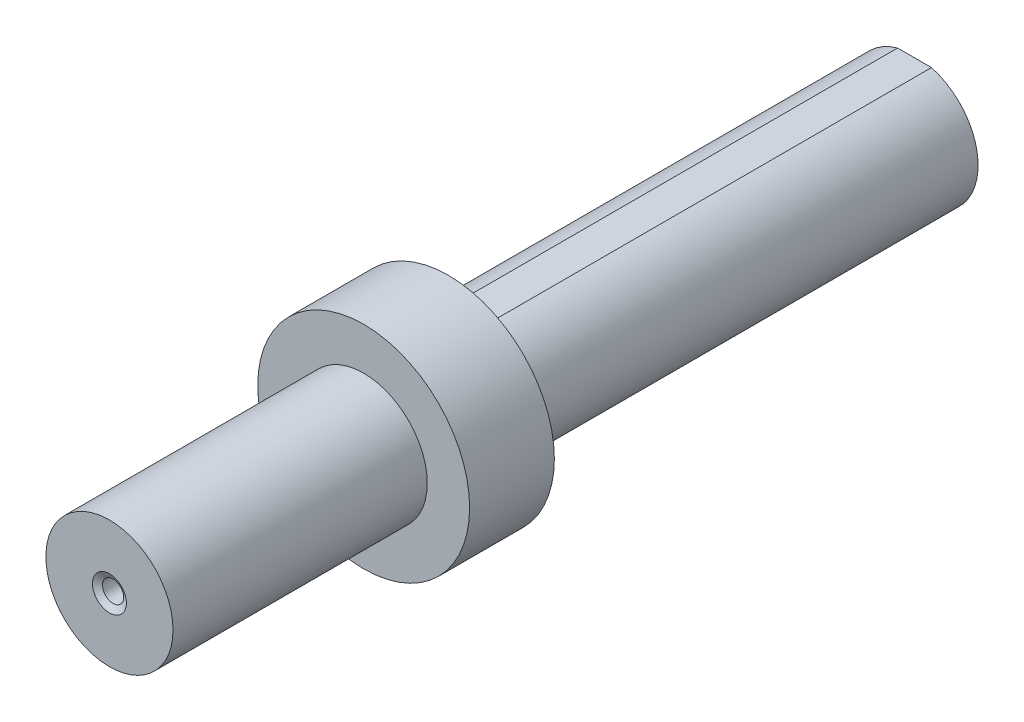
ISO-10303-21;
HEADER;
FILE_DESCRIPTION(('STEP AP214'),'2;1');
FILE_NAME('part.step','',(''),(''),'','','');
FILE_SCHEMA(('AUTOMOTIVE_DESIGN { 1 0 10303 214 1 1 1 1 }'));
ENDSEC;
DATA;
#1=APPLICATION_CONTEXT('core data for automotive mechanical design processes');
#2=APPLICATION_PROTOCOL_DEFINITION('international standard','automotive_design',2000,#1);
#3=PRODUCT_CONTEXT('',#1,'mechanical');
#4=PRODUCT('Part','Part','',(#3));
#5=PRODUCT_RELATED_PRODUCT_CATEGORY('part','',(#4));
#6=PRODUCT_DEFINITION_FORMATION('','',#4);
#7=PRODUCT_DEFINITION_CONTEXT('part definition',#1,'design');
#8=PRODUCT_DEFINITION('design','',#6,#7);
#9=PRODUCT_DEFINITION_SHAPE('','',#8);
#10=(LENGTH_UNIT() NAMED_UNIT(*) SI_UNIT(.MILLI.,.METRE.));
#11=(NAMED_UNIT(*) PLANE_ANGLE_UNIT() SI_UNIT($,.RADIAN.));
#12=(NAMED_UNIT(*) SI_UNIT($,.STERADIAN.) SOLID_ANGLE_UNIT());
#13=UNCERTAINTY_MEASURE_WITH_UNIT(LENGTH_MEASURE(1.E-05),#10,'distance_accuracy_value','');
#14=(GEOMETRIC_REPRESENTATION_CONTEXT(3) GLOBAL_UNCERTAINTY_ASSIGNED_CONTEXT((#13)) GLOBAL_UNIT_ASSIGNED_CONTEXT((#10,
#11,#12)) REPRESENTATION_CONTEXT('',''));
#15=CARTESIAN_POINT('',(0.,0.,0.));
#16=DIRECTION('',(0.,0.,1.));
#17=DIRECTION('',(1.,0.,0.));
#18=AXIS2_PLACEMENT_3D('',#15,#16,#17);
#19=CARTESIAN_POINT('',(0.,0.,10.));
#20=DIRECTION('',(0.,0.,-1.));
#21=DIRECTION('',(-1.,0.,0.));
#22=AXIS2_PLACEMENT_3D('',#19,#20,#21);
#23=CYLINDRICAL_SURFACE('',#22,12.5);
#24=CARTESIAN_POINT('',(0.,0.,10.));
#25=DIRECTION('',(0.,0.,1.));
#26=DIRECTION('',(1.,0.,0.));
#27=AXIS2_PLACEMENT_3D('',#24,#25,#26);
#28=CIRCLE('',#27,12.5);
#29=CARTESIAN_POINT('',(12.5,0.,10.));
#30=VERTEX_POINT('',#29);
#31=EDGE_CURVE('E58',#30,#30,#28,.T.);
#32=ORIENTED_EDGE('',*,*,#31,.F.);
#33=EDGE_LOOP('',(#32));
#34=FACE_BOUND('',#33,.T.);
#35=CARTESIAN_POINT('',(0.,0.,0.));
#36=DIRECTION('',(0.,0.,1.));
#37=DIRECTION('',(1.,0.,0.));
#38=AXIS2_PLACEMENT_3D('',#35,#36,#37);
#39=CIRCLE('',#38,12.5);
#40=CARTESIAN_POINT('',(12.5,0.,0.));
#41=VERTEX_POINT('',#40);
#42=EDGE_CURVE('E121',#41,#41,#39,.T.);
#43=ORIENTED_EDGE('',*,*,#42,.T.);
#44=EDGE_LOOP('',(#43));
#45=FACE_BOUND('',#44,.T.);
#46=ADVANCED_FACE('F50',(#34,#45),#23,.T.);
#47=CARTESIAN_POINT('',(0.,0.,10.));
#48=DIRECTION('',(0.,0.,1.));
#49=DIRECTION('',(1.,0.,0.));
#50=AXIS2_PLACEMENT_3D('',#47,#48,#49);
#51=PLANE('',#50);
#52=CARTESIAN_POINT('',(0.,0.,10.));
#53=DIRECTION('',(0.,0.,1.));
#54=DIRECTION('',(1.,0.,0.));
#55=AXIS2_PLACEMENT_3D('',#52,#53,#54);
#56=CIRCLE('',#55,7.5);
#57=CARTESIAN_POINT('',(7.5,0.,10.));
#58=VERTEX_POINT('',#57);
#59=EDGE_CURVE('E117',#58,#58,#56,.F.);
#60=ORIENTED_EDGE('',*,*,#59,.T.);
#61=EDGE_LOOP('',(#60));
#62=FACE_BOUND('',#61,.T.);
#63=ORIENTED_EDGE('',*,*,#31,.T.);
#64=EDGE_LOOP('',(#63));
#65=FACE_BOUND('',#64,.T.);
#66=ADVANCED_FACE('F131',(#62,#65),#51,.T.);
#67=CARTESIAN_POINT('',(0.,0.,0.));
#68=DIRECTION('',(0.,0.,1.));
#69=DIRECTION('',(1.,0.,0.));
#70=AXIS2_PLACEMENT_3D('',#67,#68,#69);
#71=PLANE('',#70);
#72=DIRECTION('',(-1.,0.,0.));
#73=VECTOR('',#72,1.);
#74=CARTESIAN_POINT('',(2.,7.22841614740048,0.));
#75=LINE('',#74,#73);
#76=CARTESIAN_POINT('',(2.,7.22841614740048,0.));
#77=VERTEX_POINT('',#76);
#78=CARTESIAN_POINT('',(-2.,7.22841614740048,0.));
#79=VERTEX_POINT('',#78);
#80=EDGE_CURVE('E80',#77,#79,#75,.T.);
#81=ORIENTED_EDGE('',*,*,#80,.T.);
#82=CARTESIAN_POINT('',(0.,0.,0.));
#83=DIRECTION('',(0.,0.,1.));
#84=DIRECTION('',(1.,0.,0.));
#85=AXIS2_PLACEMENT_3D('',#82,#83,#84);
#86=CIRCLE('',#85,7.5);
#87=EDGE_CURVE('E11',#77,#79,#86,.F.);
#88=ORIENTED_EDGE('',*,*,#87,.F.);
#89=EDGE_LOOP('',(#81,#88));
#90=FACE_BOUND('',#89,.T.);
#91=ORIENTED_EDGE('',*,*,#42,.F.);
#92=EDGE_LOOP('',(#91));
#93=FACE_BOUND('',#92,.T.);
#94=ADVANCED_FACE('F90',(#90,#93),#71,.F.);
#95=CARTESIAN_POINT('',(0.,0.,40.));
#96=DIRECTION('',(0.,0.,-1.));
#97=DIRECTION('',(-1.,0.,0.));
#98=AXIS2_PLACEMENT_3D('',#95,#96,#97);
#99=CYLINDRICAL_SURFACE('',#98,7.5);
#100=ORIENTED_EDGE('',*,*,#59,.F.);
#101=EDGE_LOOP('',(#100));
#102=FACE_BOUND('',#101,.T.);
#103=CARTESIAN_POINT('',(0.,0.,40.));
#104=DIRECTION('',(0.,0.,1.));
#105=DIRECTION('',(1.,0.,0.));
#106=AXIS2_PLACEMENT_3D('',#103,#104,#105);
#107=CIRCLE('',#106,7.5);
#108=CARTESIAN_POINT('',(7.5,0.,40.));
#109=VERTEX_POINT('',#108);
#110=EDGE_CURVE('E113',#109,#109,#107,.T.);
#111=ORIENTED_EDGE('',*,*,#110,.F.);
#112=EDGE_LOOP('',(#111));
#113=FACE_BOUND('',#112,.T.);
#114=ADVANCED_FACE('F130',(#102,#113),#99,.T.);
#115=CARTESIAN_POINT('',(0.,0.,40.));
#116=DIRECTION('',(0.,0.,1.));
#117=DIRECTION('',(1.,0.,0.));
#118=AXIS2_PLACEMENT_3D('',#115,#116,#117);
#119=PLANE('',#118);
#120=CARTESIAN_POINT('',(0.,0.,40.));
#121=DIRECTION('',(0.,0.,1.));
#122=DIRECTION('',(1.,0.,0.));
#123=AXIS2_PLACEMENT_3D('',#120,#121,#122);
#124=CIRCLE('',#123,2.);
#125=CARTESIAN_POINT('',(2.,0.,40.));
#126=VERTEX_POINT('',#125);
#127=EDGE_CURVE('E86',#126,#126,#124,.T.);
#128=ORIENTED_EDGE('',*,*,#127,.F.);
#129=EDGE_LOOP('',(#128));
#130=FACE_BOUND('',#129,.T.);
#131=ORIENTED_EDGE('',*,*,#110,.T.);
#132=EDGE_LOOP('',(#131));
#133=FACE_BOUND('',#132,.T.);
#134=ADVANCED_FACE('F137',(#130,#133),#119,.T.);
#135=CARTESIAN_POINT('',(0.,0.,-55.));
#136=DIRECTION('',(0.,0.,1.));
#137=DIRECTION('',(1.,0.,0.));
#138=AXIS2_PLACEMENT_3D('',#135,#136,#137);
#139=CYLINDRICAL_SURFACE('',#138,7.5);
#140=ORIENTED_EDGE('',*,*,#87,.T.);
#141=DIRECTION('',(0.,0.,-1.));
#142=VECTOR('',#141,1.);
#143=CARTESIAN_POINT('',(-2.,7.22841614740048,0.));
#144=LINE('',#143,#142);
#145=CARTESIAN_POINT('',(-2.,7.22841614740048,-55.));
#146=VERTEX_POINT('',#145);
#147=EDGE_CURVE('E77',#79,#146,#144,.T.);
#148=ORIENTED_EDGE('',*,*,#147,.T.);
#149=CARTESIAN_POINT('',(0.,0.,-55.));
#150=DIRECTION('',(0.,0.,-1.));
#151=DIRECTION('',(-1.,0.,0.));
#152=AXIS2_PLACEMENT_3D('',#149,#150,#151);
#153=CIRCLE('',#152,7.5);
#154=CARTESIAN_POINT('',(2.,7.22841614740048,-55.));
#155=VERTEX_POINT('',#154);
#156=EDGE_CURVE('E95',#155,#146,#153,.T.);
#157=ORIENTED_EDGE('',*,*,#156,.F.);
#158=DIRECTION('',(0.,0.,-1.));
#159=VECTOR('',#158,1.);
#160=CARTESIAN_POINT('',(2.,7.22841614740048,0.));
#161=LINE('',#160,#159);
#162=EDGE_CURVE('E65',#77,#155,#161,.T.);
#163=ORIENTED_EDGE('',*,*,#162,.F.);
#164=EDGE_LOOP('',(#140,#148,#157,#163));
#165=FACE_BOUND('',#164,.T.);
#166=ADVANCED_FACE('F94',(#165),#139,.T.);
#167=CARTESIAN_POINT('',(0.,0.,-55.));
#168=DIRECTION('',(0.,0.,-1.));
#169=DIRECTION('',(-1.,0.,0.));
#170=AXIS2_PLACEMENT_3D('',#167,#168,#169);
#171=PLANE('',#170);
#172=DIRECTION('',(-1.,0.,0.));
#173=VECTOR('',#172,1.);
#174=CARTESIAN_POINT('',(2.,7.22841614740048,-55.));
#175=LINE('',#174,#173);
#176=EDGE_CURVE('E81',#155,#146,#175,.T.);
#177=ORIENTED_EDGE('',*,*,#176,.F.);
#178=ORIENTED_EDGE('',*,*,#156,.T.);
#179=EDGE_LOOP('',(#177,#178));
#180=FACE_BOUND('',#179,.T.);
#181=ADVANCED_FACE('F171',(#180),#171,.T.);
#182=CARTESIAN_POINT('',(0.,0.,25.));
#183=DIRECTION('',(0.,0.,1.));
#184=DIRECTION('',(1.,0.,0.));
#185=AXIS2_PLACEMENT_3D('',#182,#183,#184);
#186=CONICAL_SURFACE('',#185,1.24999999999999,1.02974425867665);
#187=CARTESIAN_POINT('',(0.,0.,24.2489242262156));
#188=VERTEX_POINT('',#187);
#189=VERTEX_LOOP('',#188);
#190=FACE_BOUND('',#189,.T.);
#191=CARTESIAN_POINT('',(0.,0.,25.));
#192=DIRECTION('',(0.,0.,1.));
#193=DIRECTION('',(1.,0.,0.));
#194=AXIS2_PLACEMENT_3D('',#191,#192,#193);
#195=CIRCLE('',#194,1.24999999999999);
#196=CARTESIAN_POINT('',(1.24999999999999,0.,25.));
#197=VERTEX_POINT('',#196);
#198=EDGE_CURVE('E107',#197,#197,#195,.T.);
#199=ORIENTED_EDGE('',*,*,#198,.T.);
#200=EDGE_LOOP('',(#199));
#201=FACE_BOUND('',#200,.T.);
#202=ADVANCED_FACE('F181',(#190,#201),#186,.F.);
#203=CARTESIAN_POINT('',(0.,0.,40.));
#204=DIRECTION('',(0.,0.,1.));
#205=DIRECTION('',(1.,0.,0.));
#206=AXIS2_PLACEMENT_3D('',#203,#204,#205);
#207=CYLINDRICAL_SURFACE('',#206,1.24999999999999);
#208=ORIENTED_EDGE('',*,*,#198,.F.);
#209=EDGE_LOOP('',(#208));
#210=FACE_BOUND('',#209,.T.);
#211=CARTESIAN_POINT('',(0.,0.,39.5669872981078));
#212=DIRECTION('',(0.,0.,1.));
#213=DIRECTION('',(1.,0.,0.));
#214=AXIS2_PLACEMENT_3D('',#211,#212,#213);
#215=CIRCLE('',#214,1.25);
#216=CARTESIAN_POINT('',(1.25,0.,39.5669872981078));
#217=VERTEX_POINT('',#216);
#218=EDGE_CURVE('E103',#217,#217,#215,.T.);
#219=ORIENTED_EDGE('',*,*,#218,.T.);
#220=EDGE_LOOP('',(#219));
#221=FACE_BOUND('',#220,.T.);
#222=ADVANCED_FACE('F191',(#210,#221),#207,.F.);
#223=CARTESIAN_POINT('',(0.,0.,40.));
#224=DIRECTION('',(0.,0.,1.));
#225=DIRECTION('',(1.,0.,0.));
#226=AXIS2_PLACEMENT_3D('',#223,#224,#225);
#227=CONICAL_SURFACE('',#226,2.,1.0471975511966);
#228=ORIENTED_EDGE('',*,*,#218,.F.);
#229=EDGE_LOOP('',(#228));
#230=FACE_BOUND('',#229,.T.);
#231=ORIENTED_EDGE('',*,*,#127,.T.);
#232=EDGE_LOOP('',(#231));
#233=FACE_BOUND('',#232,.T.);
#234=ADVANCED_FACE('F197',(#230,#233),#227,.F.);
#235=CARTESIAN_POINT('',(2.,7.22841614740048,0.));
#236=DIRECTION('',(0.,-1.,0.));
#237=DIRECTION('',(0.,0.,-1.));
#238=AXIS2_PLACEMENT_3D('',#235,#236,#237);
#239=PLANE('',#238);
#240=ORIENTED_EDGE('',*,*,#176,.T.);
#241=ORIENTED_EDGE('',*,*,#147,.F.);
#242=ORIENTED_EDGE('',*,*,#80,.F.);
#243=ORIENTED_EDGE('',*,*,#162,.T.);
#244=EDGE_LOOP('',(#240,#241,#242,#243));
#245=FACE_BOUND('',#244,.T.);
#246=ADVANCED_FACE('F79',(#245),#239,.F.);
#247=CLOSED_SHELL('',(#46,#66,#94,#114,#134,#166,#181,#202,#222,#234,#246));
#248=MANIFOLD_SOLID_BREP('B2',#247);
#249=ADVANCED_BREP_SHAPE_REPRESENTATION('',(#18,#248),#14);
#250=SHAPE_DEFINITION_REPRESENTATION(#9,#249);
ENDSEC;
END-ISO-10303-21;
